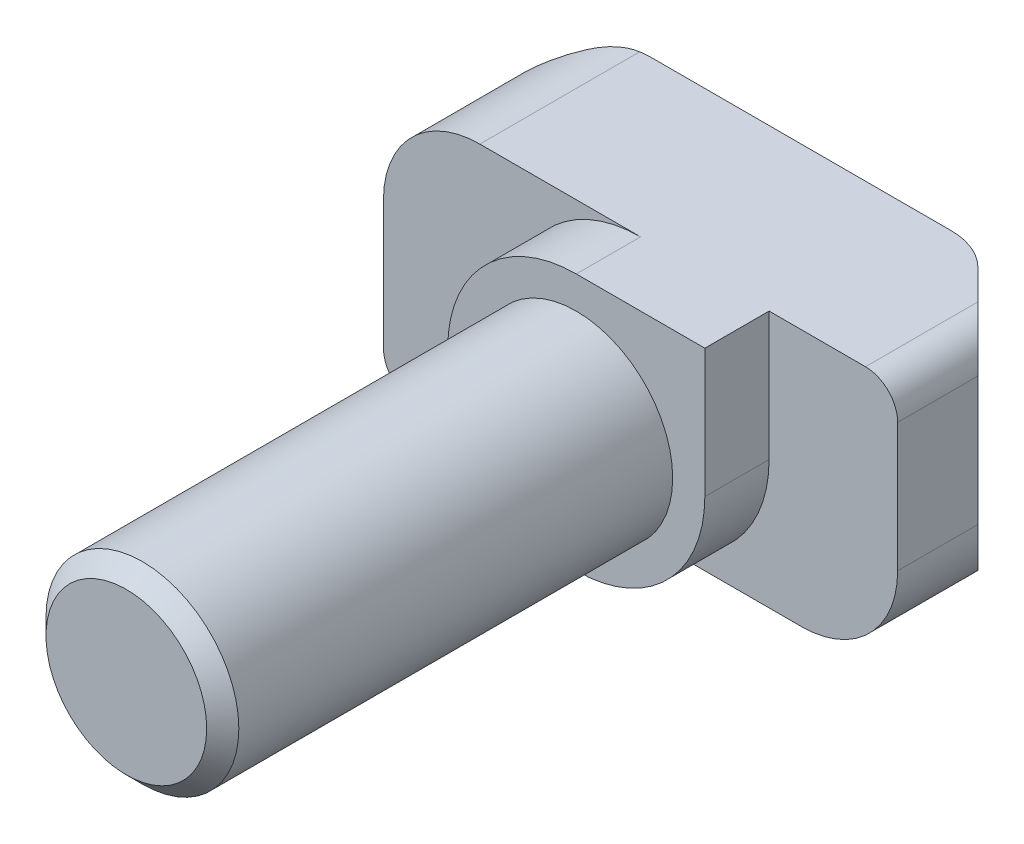
ISO-10303-21;
HEADER;
FILE_DESCRIPTION(('STEP AP214'),'2;1');
FILE_NAME('part.step','',(''),(''),'','','');
FILE_SCHEMA(('AUTOMOTIVE_DESIGN { 1 0 10303 214 1 1 1 1 }'));
ENDSEC;
DATA;
#1=APPLICATION_CONTEXT('core data for automotive mechanical design processes');
#2=APPLICATION_PROTOCOL_DEFINITION('international standard','automotive_design',2000,#1);
#3=PRODUCT_CONTEXT('',#1,'mechanical');
#4=PRODUCT('Part','Part','',(#3));
#5=PRODUCT_RELATED_PRODUCT_CATEGORY('part','',(#4));
#6=PRODUCT_DEFINITION_FORMATION('','',#4);
#7=PRODUCT_DEFINITION_CONTEXT('part definition',#1,'design');
#8=PRODUCT_DEFINITION('design','',#6,#7);
#9=PRODUCT_DEFINITION_SHAPE('','',#8);
#10=(LENGTH_UNIT() NAMED_UNIT(*) SI_UNIT(.MILLI.,.METRE.));
#11=(NAMED_UNIT(*) PLANE_ANGLE_UNIT() SI_UNIT($,.RADIAN.));
#12=(NAMED_UNIT(*) SI_UNIT($,.STERADIAN.) SOLID_ANGLE_UNIT());
#13=UNCERTAINTY_MEASURE_WITH_UNIT(LENGTH_MEASURE(1.E-05),#10,'distance_accuracy_value','');
#14=(GEOMETRIC_REPRESENTATION_CONTEXT(3) GLOBAL_UNCERTAINTY_ASSIGNED_CONTEXT((#13)) GLOBAL_UNIT_ASSIGNED_CONTEXT((#10,
#11,#12)) REPRESENTATION_CONTEXT('',''));
#15=CARTESIAN_POINT('',(0.,0.,0.));
#16=DIRECTION('',(0.,0.,1.));
#17=DIRECTION('',(1.,0.,0.));
#18=AXIS2_PLACEMENT_3D('',#15,#16,#17);
#19=CARTESIAN_POINT('',(-8.,-4.,2.5));
#20=DIRECTION('',(-1.,0.,0.));
#21=DIRECTION('',(0.,0.,1.));
#22=AXIS2_PLACEMENT_3D('',#19,#20,#21);
#23=PLANE('',#22);
#24=DIRECTION('',(0.,-1.,0.));
#25=VECTOR('',#24,1.);
#26=CARTESIAN_POINT('',(-8.,4.,5.));
#27=LINE('',#26,#25);
#28=CARTESIAN_POINT('',(-8.,1.,5.));
#29=VERTEX_POINT('',#28);
#30=CARTESIAN_POINT('',(-8.,-3.,5.));
#31=VERTEX_POINT('',#30);
#32=EDGE_CURVE('E203',#29,#31,#27,.T.);
#33=ORIENTED_EDGE('',*,*,#32,.F.);
#34=DIRECTION('',(0.,0.,1.));
#35=VECTOR('',#34,1.);
#36=CARTESIAN_POINT('',(-8.,1.,2.5));
#37=LINE('',#36,#35);
#38=CARTESIAN_POINT('',(-8.,1.,2.5));
#39=VERTEX_POINT('',#38);
#40=EDGE_CURVE('E354',#29,#39,#37,.F.);
#41=ORIENTED_EDGE('',*,*,#40,.T.);
#42=DIRECTION('',(0.,1.,0.));
#43=VECTOR('',#42,1.);
#44=CARTESIAN_POINT('',(-8.,-4.,2.5));
#45=LINE('',#44,#43);
#46=CARTESIAN_POINT('',(-8.,-3.,2.5));
#47=VERTEX_POINT('',#46);
#48=EDGE_CURVE('E230',#47,#39,#45,.T.);
#49=ORIENTED_EDGE('',*,*,#48,.F.);
#50=DIRECTION('',(0.,0.,1.));
#51=VECTOR('',#50,1.);
#52=CARTESIAN_POINT('',(-8.,-3.,5.));
#53=LINE('',#52,#51);
#54=EDGE_CURVE('E248',#47,#31,#53,.T.);
#55=ORIENTED_EDGE('',*,*,#54,.T.);
#56=EDGE_LOOP('',(#33,#41,#49,#55));
#57=FACE_BOUND('',#56,.T.);
#58=ADVANCED_FACE('F37',(#57),#23,.T.);
#59=CARTESIAN_POINT('',(-5.50000000000001,-4.,0.));
#60=DIRECTION('',(-0.707106781186548,0.,-0.707106781186547));
#61=DIRECTION('',(-0.707106781186547,0.,0.707106781186548));
#62=AXIS2_PLACEMENT_3D('',#59,#60,#61);
#63=PLANE('',#62);
#64=ORIENTED_EDGE('',*,*,#48,.T.);
#65=CARTESIAN_POINT('',(-5.,1.,-0.500000000000003));
#66=DIRECTION('',(-0.707106781186548,0.,-0.707106781186547));
#67=DIRECTION('',(-0.707106781186547,0.,0.707106781186548));
#68=AXIS2_PLACEMENT_3D('',#65,#66,#67);
#69=ELLIPSE('',#68,4.24264068711929,3.);
#70=CARTESIAN_POINT('',(-6.08578643762691,3.79661720867649,0.585786437626908));
#71=VERTEX_POINT('',#70);
#72=EDGE_CURVE('E316',#39,#71,#69,.T.);
#73=ORIENTED_EDGE('',*,*,#72,.T.);
#74=DIRECTION('',(0.,1.,0.));
#75=VECTOR('',#74,1.);
#76=CARTESIAN_POINT('',(-6.08578643762691,-4.,0.585786437626908));
#77=LINE('',#76,#75);
#78=CARTESIAN_POINT('',(-6.08578643762691,-4.,0.585786437626907));
#79=VERTEX_POINT('',#78);
#80=EDGE_CURVE('E275',#71,#79,#77,.F.);
#81=ORIENTED_EDGE('',*,*,#80,.T.);
#82=DIRECTION('',(-0.707106781186547,0.,0.707106781186548));
#83=VECTOR('',#82,1.);
#84=CARTESIAN_POINT('',(-5.50000000000001,-4.,0.));
#85=LINE('',#84,#83);
#86=CARTESIAN_POINT('',(-7.,-4.,1.5));
#87=VERTEX_POINT('',#86);
#88=EDGE_CURVE('E221',#79,#87,#85,.T.);
#89=ORIENTED_EDGE('',*,*,#88,.T.);
#90=CARTESIAN_POINT('',(-7.,-3.,1.5));
#91=DIRECTION('',(-0.707106781186548,0.,-0.707106781186547));
#92=DIRECTION('',(0.707106781186547,0.,-0.707106781186548));
#93=AXIS2_PLACEMENT_3D('',#90,#91,#92);
#94=ELLIPSE('',#93,1.4142135623731,1.);
#95=EDGE_CURVE('E256',#87,#47,#94,.T.);
#96=ORIENTED_EDGE('',*,*,#95,.T.);
#97=EDGE_LOOP('',(#64,#73,#81,#89,#96));
#98=FACE_BOUND('',#97,.T.);
#99=ADVANCED_FACE('F349',(#98),#63,.T.);
#100=CARTESIAN_POINT('',(5.5,-4.,0.));
#101=DIRECTION('',(0.,0.,-1.));
#102=DIRECTION('',(-1.,0.,0.));
#103=AXIS2_PLACEMENT_3D('',#100,#101,#102);
#104=PLANE('',#103);
#105=DIRECTION('',(-1.,0.,0.));
#106=VECTOR('',#105,1.);
#107=CARTESIAN_POINT('',(5.5,4.,0.));
#108=LINE('',#107,#106);
#109=CARTESIAN_POINT('',(4.67157287525381,4.,0.));
#110=VERTEX_POINT('',#109);
#111=CARTESIAN_POINT('',(-4.67157287525381,4.,0.));
#112=VERTEX_POINT('',#111);
#113=EDGE_CURVE('E218',#110,#112,#108,.T.);
#114=ORIENTED_EDGE('',*,*,#113,.F.);
#115=DIRECTION('',(0.,1.,0.));
#116=VECTOR('',#115,1.);
#117=CARTESIAN_POINT('',(4.67157287525381,-4.,0.));
#118=LINE('',#117,#116);
#119=CARTESIAN_POINT('',(4.67157287525381,-4.,0.));
#120=VERTEX_POINT('',#119);
#121=EDGE_CURVE('E268',#110,#120,#118,.F.);
#122=ORIENTED_EDGE('',*,*,#121,.T.);
#123=DIRECTION('',(-1.,0.,0.));
#124=VECTOR('',#123,1.);
#125=CARTESIAN_POINT('',(5.5,-4.,0.));
#126=LINE('',#125,#124);
#127=CARTESIAN_POINT('',(-4.67157287525381,-4.,0.));
#128=VERTEX_POINT('',#127);
#129=EDGE_CURVE('E217',#120,#128,#126,.T.);
#130=ORIENTED_EDGE('',*,*,#129,.T.);
#131=DIRECTION('',(0.,1.,0.));
#132=VECTOR('',#131,1.);
#133=CARTESIAN_POINT('',(-4.67157287525381,-4.,0.));
#134=LINE('',#133,#132);
#135=EDGE_CURVE('E265',#128,#112,#134,.T.);
#136=ORIENTED_EDGE('',*,*,#135,.T.);
#137=EDGE_LOOP('',(#114,#122,#130,#136));
#138=FACE_BOUND('',#137,.T.);
#139=ADVANCED_FACE('F380',(#138),#104,.T.);
#140=CARTESIAN_POINT('',(8.,-4.,2.5));
#141=DIRECTION('',(0.707106781186547,0.,-0.707106781186548));
#142=DIRECTION('',(-0.707106781186548,0.,-0.707106781186547));
#143=AXIS2_PLACEMENT_3D('',#140,#141,#142);
#144=PLANE('',#143);
#145=DIRECTION('',(0.,1.,0.));
#146=VECTOR('',#145,1.);
#147=CARTESIAN_POINT('',(8.,-4.,2.5));
#148=LINE('',#147,#146);
#149=CARTESIAN_POINT('',(8.,-1.,2.5));
#150=VERTEX_POINT('',#149);
#151=CARTESIAN_POINT('',(8.,3.,2.5));
#152=VERTEX_POINT('',#151);
#153=EDGE_CURVE('E223',#150,#152,#148,.T.);
#154=ORIENTED_EDGE('',*,*,#153,.F.);
#155=CARTESIAN_POINT('',(5.,-1.,-0.499999999999997));
#156=DIRECTION('',(0.707106781186547,0.,-0.707106781186548));
#157=DIRECTION('',(0.707106781186548,0.,0.707106781186547));
#158=AXIS2_PLACEMENT_3D('',#155,#156,#157);
#159=ELLIPSE('',#158,4.24264068711928,3.);
#160=CARTESIAN_POINT('',(6.0857864376269,-3.79661720867649,0.585786437626905));
#161=VERTEX_POINT('',#160);
#162=EDGE_CURVE('E280',#150,#161,#159,.T.);
#163=ORIENTED_EDGE('',*,*,#162,.T.);
#164=DIRECTION('',(0.,1.,0.));
#165=VECTOR('',#164,1.);
#166=CARTESIAN_POINT('',(6.0857864376269,-4.,0.585786437626905));
#167=LINE('',#166,#165);
#168=CARTESIAN_POINT('',(6.0857864376269,4.,0.585786437626904));
#169=VERTEX_POINT('',#168);
#170=EDGE_CURVE('E258',#161,#169,#167,.T.);
#171=ORIENTED_EDGE('',*,*,#170,.T.);
#172=DIRECTION('',(-0.707106781186548,0.,-0.707106781186547));
#173=VECTOR('',#172,1.);
#174=CARTESIAN_POINT('',(8.,4.,2.5));
#175=LINE('',#174,#173);
#176=CARTESIAN_POINT('',(7.,4.,1.5));
#177=VERTEX_POINT('',#176);
#178=EDGE_CURVE('E225',#177,#169,#175,.T.);
#179=ORIENTED_EDGE('',*,*,#178,.F.);
#180=CARTESIAN_POINT('',(7.,3.,1.5));
#181=DIRECTION('',(0.707106781186547,0.,-0.707106781186548));
#182=DIRECTION('',(-0.707106781186548,0.,-0.707106781186547));
#183=AXIS2_PLACEMENT_3D('',#180,#181,#182);
#184=ELLIPSE('',#183,1.41421356237309,1.);
#185=EDGE_CURVE('E242',#177,#152,#184,.T.);
#186=ORIENTED_EDGE('',*,*,#185,.T.);
#187=EDGE_LOOP('',(#154,#163,#171,#179,#186));
#188=FACE_BOUND('',#187,.T.);
#189=ADVANCED_FACE('F369',(#188),#144,.T.);
#190=CARTESIAN_POINT('',(8.,-4.,7.));
#191=DIRECTION('',(1.,0.,0.));
#192=DIRECTION('',(0.,0.,-1.));
#193=AXIS2_PLACEMENT_3D('',#190,#191,#192);
#194=PLANE('',#193);
#195=DIRECTION('',(0.,-1.,0.));
#196=VECTOR('',#195,1.);
#197=CARTESIAN_POINT('',(8.,4.,5.));
#198=LINE('',#197,#196);
#199=CARTESIAN_POINT('',(8.,3.,5.));
#200=VERTEX_POINT('',#199);
#201=CARTESIAN_POINT('',(8.,-1.,5.));
#202=VERTEX_POINT('',#201);
#203=EDGE_CURVE('E176',#200,#202,#198,.T.);
#204=ORIENTED_EDGE('',*,*,#203,.T.);
#205=DIRECTION('',(0.,0.,-1.));
#206=VECTOR('',#205,1.);
#207=CARTESIAN_POINT('',(8.,-1.,2.5));
#208=LINE('',#207,#206);
#209=EDGE_CURVE('E277',#202,#150,#208,.T.);
#210=ORIENTED_EDGE('',*,*,#209,.T.);
#211=ORIENTED_EDGE('',*,*,#153,.T.);
#212=DIRECTION('',(0.,0.,-1.));
#213=VECTOR('',#212,1.);
#214=CARTESIAN_POINT('',(8.,3.,7.));
#215=LINE('',#214,#213);
#216=EDGE_CURVE('E245',#152,#200,#215,.F.);
#217=ORIENTED_EDGE('',*,*,#216,.T.);
#218=EDGE_LOOP('',(#204,#210,#211,#217));
#219=FACE_BOUND('',#218,.T.);
#220=ADVANCED_FACE('F367',(#219),#194,.T.);
#221=CARTESIAN_POINT('',(-8.,-4.,7.));
#222=DIRECTION('',(0.,0.,1.));
#223=DIRECTION('',(1.,0.,0.));
#224=AXIS2_PLACEMENT_3D('',#221,#222,#223);
#225=PLANE('',#224);
#226=CARTESIAN_POINT('',(0.,0.,7.));
#227=DIRECTION('',(0.,0.,1.));
#228=DIRECTION('',(1.,0.,0.));
#229=AXIS2_PLACEMENT_3D('',#226,#227,#228);
#230=CIRCLE('',#229,3.);
#231=CARTESIAN_POINT('',(3.,0.,7.));
#232=VERTEX_POINT('',#231);
#233=EDGE_CURVE('E195',#232,#232,#230,.T.);
#234=ORIENTED_EDGE('',*,*,#233,.F.);
#235=EDGE_LOOP('',(#234));
#236=FACE_BOUND('',#235,.T.);
#237=DIRECTION('',(1.,0.,0.));
#238=VECTOR('',#237,1.);
#239=CARTESIAN_POINT('',(-8.,-4.,7.));
#240=LINE('',#239,#238);
#241=CARTESIAN_POINT('',(-4.,-4.,7.));
#242=VERTEX_POINT('',#241);
#243=CARTESIAN_POINT('',(0.,-4.,7.));
#244=VERTEX_POINT('',#243);
#245=EDGE_CURVE('E214',#242,#244,#240,.T.);
#246=ORIENTED_EDGE('',*,*,#245,.T.);
#247=CARTESIAN_POINT('',(0.,0.,7.));
#248=DIRECTION('',(0.,0.,1.));
#249=DIRECTION('',(1.,0.,0.));
#250=AXIS2_PLACEMENT_3D('',#247,#248,#249);
#251=CIRCLE('',#250,4.);
#252=CARTESIAN_POINT('',(4.,0.,7.));
#253=VERTEX_POINT('',#252);
#254=EDGE_CURVE('E323',#244,#253,#251,.T.);
#255=ORIENTED_EDGE('',*,*,#254,.T.);
#256=DIRECTION('',(0.,-1.,0.));
#257=VECTOR('',#256,1.);
#258=CARTESIAN_POINT('',(4.,4.,7.));
#259=LINE('',#258,#257);
#260=CARTESIAN_POINT('',(4.,4.,7.));
#261=VERTEX_POINT('',#260);
#262=EDGE_CURVE('E197',#261,#253,#259,.T.);
#263=ORIENTED_EDGE('',*,*,#262,.F.);
#264=DIRECTION('',(1.,0.,0.));
#265=VECTOR('',#264,1.);
#266=CARTESIAN_POINT('',(-8.,4.,7.));
#267=LINE('',#266,#265);
#268=CARTESIAN_POINT('',(0.,4.,7.));
#269=VERTEX_POINT('',#268);
#270=EDGE_CURVE('E190',#269,#261,#267,.T.);
#271=ORIENTED_EDGE('',*,*,#270,.F.);
#272=CARTESIAN_POINT('',(0.,0.,7.));
#273=DIRECTION('',(0.,0.,1.));
#274=DIRECTION('',(1.,0.,0.));
#275=AXIS2_PLACEMENT_3D('',#272,#273,#274);
#276=CIRCLE('',#275,4.);
#277=CARTESIAN_POINT('',(-4.,0.,7.));
#278=VERTEX_POINT('',#277);
#279=EDGE_CURVE('E321',#269,#278,#276,.T.);
#280=ORIENTED_EDGE('',*,*,#279,.T.);
#281=DIRECTION('',(0.,-1.,0.));
#282=VECTOR('',#281,1.);
#283=CARTESIAN_POINT('',(-4.,4.,7.));
#284=LINE('',#283,#282);
#285=EDGE_CURVE('E209',#278,#242,#284,.T.);
#286=ORIENTED_EDGE('',*,*,#285,.T.);
#287=EDGE_LOOP('',(#246,#255,#263,#271,#280,#286));
#288=FACE_BOUND('',#287,.T.);
#289=ADVANCED_FACE('F336',(#236,#288),#225,.T.);
#290=CARTESIAN_POINT('',(0.,-4.,0.));
#291=DIRECTION('',(0.,1.,0.));
#292=DIRECTION('',(0.,0.,1.));
#293=AXIS2_PLACEMENT_3D('',#290,#291,#292);
#294=PLANE('',#293);
#295=DIRECTION('',(1.,0.,0.));
#296=VECTOR('',#295,1.);
#297=CARTESIAN_POINT('',(4.,-4.,5.));
#298=LINE('',#297,#296);
#299=CARTESIAN_POINT('',(0.,-4.,5.));
#300=VERTEX_POINT('',#299);
#301=CARTESIAN_POINT('',(5.,-4.,5.));
#302=VERTEX_POINT('',#301);
#303=EDGE_CURVE('E191',#300,#302,#298,.T.);
#304=ORIENTED_EDGE('',*,*,#303,.F.);
#305=DIRECTION('',(0.,0.,-1.));
#306=VECTOR('',#305,1.);
#307=CARTESIAN_POINT('',(0.,-4.,0.));
#308=LINE('',#307,#306);
#309=EDGE_CURVE('E319',#300,#244,#308,.F.);
#310=ORIENTED_EDGE('',*,*,#309,.T.);
#311=ORIENTED_EDGE('',*,*,#245,.F.);
#312=DIRECTION('',(0.,0.,1.));
#313=VECTOR('',#312,1.);
#314=CARTESIAN_POINT('',(-4.,-4.,5.));
#315=LINE('',#314,#313);
#316=CARTESIAN_POINT('',(-4.,-4.,5.));
#317=VERTEX_POINT('',#316);
#318=EDGE_CURVE('E204',#317,#242,#315,.T.);
#319=ORIENTED_EDGE('',*,*,#318,.F.);
#320=DIRECTION('',(1.,0.,0.));
#321=VECTOR('',#320,1.);
#322=CARTESIAN_POINT('',(-8.,-4.,5.));
#323=LINE('',#322,#321);
#324=CARTESIAN_POINT('',(-7.,-4.,5.));
#325=VERTEX_POINT('',#324);
#326=EDGE_CURVE('E199',#325,#317,#323,.T.);
#327=ORIENTED_EDGE('',*,*,#326,.F.);
#328=DIRECTION('',(0.,0.,1.));
#329=VECTOR('',#328,1.);
#330=CARTESIAN_POINT('',(-7.,-4.,2.5));
#331=LINE('',#330,#329);
#332=EDGE_CURVE('E253',#325,#87,#331,.F.);
#333=ORIENTED_EDGE('',*,*,#332,.T.);
#334=ORIENTED_EDGE('',*,*,#88,.F.);
#335=CARTESIAN_POINT('',(-4.67157287525381,-4.,2.));
#336=DIRECTION('',(0.,1.,0.));
#337=DIRECTION('',(0.,0.,1.));
#338=AXIS2_PLACEMENT_3D('',#335,#336,#337);
#339=CIRCLE('',#338,2.);
#340=EDGE_CURVE('E270',#79,#128,#339,.F.);
#341=ORIENTED_EDGE('',*,*,#340,.T.);
#342=ORIENTED_EDGE('',*,*,#129,.F.);
#343=CARTESIAN_POINT('',(4.67157287525381,-4.,2.));
#344=DIRECTION('',(0.,1.,0.));
#345=DIRECTION('',(0.,0.,1.));
#346=AXIS2_PLACEMENT_3D('',#343,#344,#345);
#347=CIRCLE('',#346,2.);
#348=CARTESIAN_POINT('',(5.,-4.,0.0271503798487459));
#349=VERTEX_POINT('',#348);
#350=EDGE_CURVE('E272',#120,#349,#347,.F.);
#351=ORIENTED_EDGE('',*,*,#350,.T.);
#352=DIRECTION('',(0.,0.,-1.));
#353=VECTOR('',#352,1.);
#354=CARTESIAN_POINT('',(5.,-4.,5.));
#355=LINE('',#354,#353);
#356=EDGE_CURVE('E290',#349,#302,#355,.F.);
#357=ORIENTED_EDGE('',*,*,#356,.T.);
#358=EDGE_LOOP('',(#304,#310,#311,#319,#327,#333,#334,#341,#342,#351,#357));
#359=FACE_BOUND('',#358,.T.);
#360=ADVANCED_FACE('F333',(#359),#294,.F.);
#361=CARTESIAN_POINT('',(0.,4.,0.));
#362=DIRECTION('',(0.,1.,0.));
#363=DIRECTION('',(0.,0.,1.));
#364=AXIS2_PLACEMENT_3D('',#361,#362,#363);
#365=PLANE('',#364);
#366=DIRECTION('',(1.,0.,0.));
#367=VECTOR('',#366,1.);
#368=CARTESIAN_POINT('',(-8.,4.,5.));
#369=LINE('',#368,#367);
#370=CARTESIAN_POINT('',(-5.,4.,5.));
#371=VERTEX_POINT('',#370);
#372=CARTESIAN_POINT('',(0.,4.,5.));
#373=VERTEX_POINT('',#372);
#374=EDGE_CURVE('E60',#371,#373,#369,.T.);
#375=ORIENTED_EDGE('',*,*,#374,.T.);
#376=DIRECTION('',(0.,0.,1.));
#377=VECTOR('',#376,1.);
#378=CARTESIAN_POINT('',(0.,4.,7.));
#379=LINE('',#378,#377);
#380=EDGE_CURVE('E325',#373,#269,#379,.T.);
#381=ORIENTED_EDGE('',*,*,#380,.T.);
#382=ORIENTED_EDGE('',*,*,#270,.T.);
#383=DIRECTION('',(0.,0.,-1.));
#384=VECTOR('',#383,1.);
#385=CARTESIAN_POINT('',(4.,4.,7.));
#386=LINE('',#385,#384);
#387=CARTESIAN_POINT('',(4.,4.,5.));
#388=VERTEX_POINT('',#387);
#389=EDGE_CURVE('E170',#261,#388,#386,.T.);
#390=ORIENTED_EDGE('',*,*,#389,.T.);
#391=DIRECTION('',(1.,0.,0.));
#392=VECTOR('',#391,1.);
#393=CARTESIAN_POINT('',(4.,4.,5.));
#394=LINE('',#393,#392);
#395=CARTESIAN_POINT('',(7.,4.,5.));
#396=VERTEX_POINT('',#395);
#397=EDGE_CURVE('E177',#388,#396,#394,.T.);
#398=ORIENTED_EDGE('',*,*,#397,.T.);
#399=DIRECTION('',(0.,0.,-1.));
#400=VECTOR('',#399,1.);
#401=CARTESIAN_POINT('',(7.,4.,0.));
#402=LINE('',#401,#400);
#403=EDGE_CURVE('E240',#396,#177,#402,.T.);
#404=ORIENTED_EDGE('',*,*,#403,.T.);
#405=ORIENTED_EDGE('',*,*,#178,.T.);
#406=CARTESIAN_POINT('',(4.67157287525381,4.,2.));
#407=DIRECTION('',(0.,1.,0.));
#408=DIRECTION('',(0.,0.,1.));
#409=AXIS2_PLACEMENT_3D('',#406,#407,#408);
#410=CIRCLE('',#409,2.);
#411=EDGE_CURVE('E263',#169,#110,#410,.T.);
#412=ORIENTED_EDGE('',*,*,#411,.T.);
#413=ORIENTED_EDGE('',*,*,#113,.T.);
#414=CARTESIAN_POINT('',(-4.67157287525381,4.,2.));
#415=DIRECTION('',(0.,1.,0.));
#416=DIRECTION('',(0.,0.,1.));
#417=AXIS2_PLACEMENT_3D('',#414,#415,#416);
#418=CIRCLE('',#417,2.);
#419=CARTESIAN_POINT('',(-5.,4.,0.0271503798487459));
#420=VERTEX_POINT('',#419);
#421=EDGE_CURVE('E260',#112,#420,#418,.T.);
#422=ORIENTED_EDGE('',*,*,#421,.T.);
#423=DIRECTION('',(0.,0.,1.));
#424=VECTOR('',#423,1.);
#425=CARTESIAN_POINT('',(-5.,4.,0.));
#426=LINE('',#425,#424);
#427=EDGE_CURVE('E356',#420,#371,#426,.T.);
#428=ORIENTED_EDGE('',*,*,#427,.T.);
#429=EDGE_LOOP('',(#375,#381,#382,#390,#398,#404,#405,#412,#413,#422,#428));
#430=FACE_BOUND('',#429,.T.);
#431=ADVANCED_FACE('F188',(#430),#365,.T.);
#432=CARTESIAN_POINT('',(-4.,4.,5.));
#433=DIRECTION('',(1.,0.,0.));
#434=DIRECTION('',(0.,0.,-1.));
#435=AXIS2_PLACEMENT_3D('',#432,#433,#434);
#436=PLANE('',#435);
#437=ORIENTED_EDGE('',*,*,#285,.F.);
#438=DIRECTION('',(0.,0.,1.));
#439=VECTOR('',#438,1.);
#440=CARTESIAN_POINT('',(-4.,0.,5.));
#441=LINE('',#440,#439);
#442=CARTESIAN_POINT('',(-4.,0.,5.));
#443=VERTEX_POINT('',#442);
#444=EDGE_CURVE('E52',#278,#443,#441,.F.);
#445=ORIENTED_EDGE('',*,*,#444,.T.);
#446=DIRECTION('',(0.,-1.,0.));
#447=VECTOR('',#446,1.);
#448=CARTESIAN_POINT('',(-4.,4.,5.));
#449=LINE('',#448,#447);
#450=EDGE_CURVE('E211',#443,#317,#449,.T.);
#451=ORIENTED_EDGE('',*,*,#450,.T.);
#452=ORIENTED_EDGE('',*,*,#318,.T.);
#453=EDGE_LOOP('',(#437,#445,#451,#452));
#454=FACE_BOUND('',#453,.T.);
#455=ADVANCED_FACE('F337',(#454),#436,.F.);
#456=CARTESIAN_POINT('',(-8.,4.,5.));
#457=DIRECTION('',(0.,0.,-1.));
#458=DIRECTION('',(-1.,0.,0.));
#459=AXIS2_PLACEMENT_3D('',#456,#457,#458);
#460=PLANE('',#459);
#461=ORIENTED_EDGE('',*,*,#374,.F.);
#462=CARTESIAN_POINT('',(-5.,1.,5.));
#463=DIRECTION('',(0.,0.,-1.));
#464=DIRECTION('',(-1.,0.,0.));
#465=AXIS2_PLACEMENT_3D('',#462,#463,#464);
#466=CIRCLE('',#465,3.);
#467=EDGE_CURVE('E355',#371,#29,#466,.F.);
#468=ORIENTED_EDGE('',*,*,#467,.T.);
#469=ORIENTED_EDGE('',*,*,#32,.T.);
#470=CARTESIAN_POINT('',(-7.,-3.,5.));
#471=DIRECTION('',(0.,0.,-1.));
#472=DIRECTION('',(-1.,0.,0.));
#473=AXIS2_PLACEMENT_3D('',#470,#471,#472);
#474=CIRCLE('',#473,1.);
#475=EDGE_CURVE('E251',#31,#325,#474,.F.);
#476=ORIENTED_EDGE('',*,*,#475,.T.);
#477=ORIENTED_EDGE('',*,*,#326,.T.);
#478=ORIENTED_EDGE('',*,*,#450,.F.);
#479=CARTESIAN_POINT('',(0.,0.,5.));
#480=DIRECTION('',(0.,0.,-1.));
#481=DIRECTION('',(-1.,0.,0.));
#482=AXIS2_PLACEMENT_3D('',#479,#480,#481);
#483=CIRCLE('',#482,4.);
#484=EDGE_CURVE('E11',#443,#373,#483,.T.);
#485=ORIENTED_EDGE('',*,*,#484,.T.);
#486=EDGE_LOOP('',(#461,#468,#469,#476,#477,#478,#485));
#487=FACE_BOUND('',#486,.T.);
#488=ADVANCED_FACE('F505',(#487),#460,.F.);
#489=CARTESIAN_POINT('',(4.,4.,7.));
#490=DIRECTION('',(-1.,0.,0.));
#491=DIRECTION('',(0.,0.,1.));
#492=AXIS2_PLACEMENT_3D('',#489,#490,#491);
#493=PLANE('',#492);
#494=ORIENTED_EDGE('',*,*,#262,.T.);
#495=DIRECTION('',(0.,0.,-1.));
#496=VECTOR('',#495,1.);
#497=CARTESIAN_POINT('',(4.,0.,7.));
#498=LINE('',#497,#496);
#499=CARTESIAN_POINT('',(4.,0.,5.));
#500=VERTEX_POINT('',#499);
#501=EDGE_CURVE('E173',#253,#500,#498,.T.);
#502=ORIENTED_EDGE('',*,*,#501,.T.);
#503=DIRECTION('',(0.,-1.,0.));
#504=VECTOR('',#503,1.);
#505=CARTESIAN_POINT('',(4.,4.,5.));
#506=LINE('',#505,#504);
#507=EDGE_CURVE('E165',#388,#500,#506,.T.);
#508=ORIENTED_EDGE('',*,*,#507,.F.);
#509=ORIENTED_EDGE('',*,*,#389,.F.);
#510=EDGE_LOOP('',(#494,#502,#508,#509));
#511=FACE_BOUND('',#510,.T.);
#512=ADVANCED_FACE('F168',(#511),#493,.F.);
#513=CARTESIAN_POINT('',(4.,4.,5.));
#514=DIRECTION('',(0.,0.,-1.));
#515=DIRECTION('',(-1.,0.,0.));
#516=AXIS2_PLACEMENT_3D('',#513,#514,#515);
#517=PLANE('',#516);
#518=ORIENTED_EDGE('',*,*,#303,.T.);
#519=CARTESIAN_POINT('',(5.,-1.,5.));
#520=DIRECTION('',(0.,0.,-1.));
#521=DIRECTION('',(-1.,0.,0.));
#522=AXIS2_PLACEMENT_3D('',#519,#520,#521);
#523=CIRCLE('',#522,3.);
#524=EDGE_CURVE('E359',#302,#202,#523,.F.);
#525=ORIENTED_EDGE('',*,*,#524,.T.);
#526=ORIENTED_EDGE('',*,*,#203,.F.);
#527=CARTESIAN_POINT('',(7.,3.,5.));
#528=DIRECTION('',(0.,0.,-1.));
#529=DIRECTION('',(-1.,0.,0.));
#530=AXIS2_PLACEMENT_3D('',#527,#528,#529);
#531=CIRCLE('',#530,1.);
#532=EDGE_CURVE('E184',#200,#396,#531,.F.);
#533=ORIENTED_EDGE('',*,*,#532,.T.);
#534=ORIENTED_EDGE('',*,*,#397,.F.);
#535=ORIENTED_EDGE('',*,*,#507,.T.);
#536=CARTESIAN_POINT('',(0.,0.,5.));
#537=DIRECTION('',(0.,0.,-1.));
#538=DIRECTION('',(-1.,0.,0.));
#539=AXIS2_PLACEMENT_3D('',#536,#537,#538);
#540=CIRCLE('',#539,4.);
#541=EDGE_CURVE('E45',#500,#300,#540,.T.);
#542=ORIENTED_EDGE('',*,*,#541,.T.);
#543=EDGE_LOOP('',(#518,#525,#526,#533,#534,#535,#542));
#544=FACE_BOUND('',#543,.T.);
#545=ADVANCED_FACE('F181',(#544),#517,.F.);
#546=CARTESIAN_POINT('',(0.,0.,7.));
#547=DIRECTION('',(0.,0.,1.));
#548=DIRECTION('',(1.,0.,0.));
#549=AXIS2_PLACEMENT_3D('',#546,#547,#548);
#550=CYLINDRICAL_SURFACE('',#549,3.);
#551=CARTESIAN_POINT('',(0.,0.,20.4999960046574));
#552=DIRECTION('',(0.,0.,1.));
#553=DIRECTION('',(1.,0.,0.));
#554=AXIS2_PLACEMENT_3D('',#551,#552,#553);
#555=CIRCLE('',#554,3.);
#556=CARTESIAN_POINT('',(3.,0.,20.4999960046574));
#557=VERTEX_POINT('',#556);
#558=EDGE_CURVE('E237',#557,#557,#555,.F.);
#559=ORIENTED_EDGE('',*,*,#558,.T.);
#560=EDGE_LOOP('',(#559));
#561=FACE_BOUND('',#560,.T.);
#562=ORIENTED_EDGE('',*,*,#233,.T.);
#563=EDGE_LOOP('',(#562));
#564=FACE_BOUND('',#563,.T.);
#565=ADVANCED_FACE('F530',(#561,#564),#550,.T.);
#566=CARTESIAN_POINT('',(0.,0.,21.));
#567=DIRECTION('',(0.,0.,1.));
#568=DIRECTION('',(1.,0.,0.));
#569=AXIS2_PLACEMENT_3D('',#566,#567,#568);
#570=PLANE('',#569);
#571=CARTESIAN_POINT('',(0.,0.,21.));
#572=DIRECTION('',(0.,0.,1.));
#573=DIRECTION('',(1.,0.,0.));
#574=AXIS2_PLACEMENT_3D('',#571,#572,#573);
#575=CIRCLE('',#574,2.49999709508467);
#576=CARTESIAN_POINT('',(2.49999709508467,0.,21.));
#577=VERTEX_POINT('',#576);
#578=EDGE_CURVE('E234',#577,#577,#575,.T.);
#579=ORIENTED_EDGE('',*,*,#578,.T.);
#580=EDGE_LOOP('',(#579));
#581=FACE_BOUND('',#580,.T.);
#582=ADVANCED_FACE('F403',(#581),#570,.T.);
#583=CARTESIAN_POINT('',(0.,0.,21.));
#584=DIRECTION('',(0.,0.,-1.));
#585=DIRECTION('',(-1.,0.,0.));
#586=AXIS2_PLACEMENT_3D('',#583,#584,#585);
#587=CONICAL_SURFACE('',#586,2.49999709508467,0.785397072977674);
#588=ORIENTED_EDGE('',*,*,#558,.F.);
#589=EDGE_LOOP('',(#588));
#590=FACE_BOUND('',#589,.T.);
#591=ORIENTED_EDGE('',*,*,#578,.F.);
#592=EDGE_LOOP('',(#591));
#593=FACE_BOUND('',#592,.T.);
#594=ADVANCED_FACE('F398',(#590,#593),#587,.T.);
#595=CARTESIAN_POINT('',(7.,3.,0.));
#596=DIRECTION('',(0.,0.,-1.));
#597=DIRECTION('',(-1.,0.,0.));
#598=AXIS2_PLACEMENT_3D('',#595,#596,#597);
#599=CYLINDRICAL_SURFACE('',#598,1.);
#600=ORIENTED_EDGE('',*,*,#532,.F.);
#601=ORIENTED_EDGE('',*,*,#216,.F.);
#602=ORIENTED_EDGE('',*,*,#185,.F.);
#603=ORIENTED_EDGE('',*,*,#403,.F.);
#604=EDGE_LOOP('',(#600,#601,#602,#603));
#605=FACE_BOUND('',#604,.T.);
#606=ADVANCED_FACE('F374',(#605),#599,.T.);
#607=CARTESIAN_POINT('',(-7.,-3.,2.5));
#608=DIRECTION('',(0.,0.,-1.));
#609=DIRECTION('',(-1.,0.,0.));
#610=AXIS2_PLACEMENT_3D('',#607,#608,#609);
#611=CYLINDRICAL_SURFACE('',#610,1.);
#612=ORIENTED_EDGE('',*,*,#95,.F.);
#613=ORIENTED_EDGE('',*,*,#332,.F.);
#614=ORIENTED_EDGE('',*,*,#475,.F.);
#615=ORIENTED_EDGE('',*,*,#54,.F.);
#616=EDGE_LOOP('',(#612,#613,#614,#615));
#617=FACE_BOUND('',#616,.T.);
#618=ADVANCED_FACE('F345',(#617),#611,.T.);
#619=CARTESIAN_POINT('',(4.67157287525381,-4.,2.));
#620=DIRECTION('',(0.,1.,0.));
#621=DIRECTION('',(0.,0.,1.));
#622=AXIS2_PLACEMENT_3D('',#619,#620,#621);
#623=CYLINDRICAL_SURFACE('',#622,2.);
#624=ORIENTED_EDGE('',*,*,#170,.F.);
#625=CARTESIAN_POINT('',(6.0857864376269,-3.79661720867649,0.585786437626905));
#626=CARTESIAN_POINT('',(6.04835150685286,-3.81114934512866,0.548362623812733));
#627=CARTESIAN_POINT('',(6.00940693884797,-3.82540497787574,0.51238203401474));
#628=CARTESIAN_POINT('',(5.92856629680353,-3.85299794440073,0.443464497667013));
#629=CARTESIAN_POINT('',(5.88666841905598,-3.86633470698169,0.41052944003534));
#630=CARTESIAN_POINT('',(5.75925459459005,-3.90364871527323,0.318428419512852));
#631=CARTESIAN_POINT('',(5.66980993129956,-3.92582259461321,0.263758889572601));
#632=CARTESIAN_POINT('',(5.53190728817466,-3.95281541653805,0.193817777100017));
#633=CARTESIAN_POINT('',(5.48674538457817,-3.96061589512063,0.172985515741081));
#634=CARTESIAN_POINT('',(5.39473183401763,-3.97428072691575,0.134652598525427));
#635=CARTESIAN_POINT('',(5.34788037628463,-3.98014529620882,0.11715157093852));
#636=CARTESIAN_POINT('',(5.25150247934223,-3.98984144469628,0.0852346928986245));
#637=CARTESIAN_POINT('',(5.20193794741303,-3.99361346489451,0.0709155747572581));
#638=CARTESIAN_POINT('',(5.10169783004914,-3.99869872157745,0.0461140513930794));
#639=CARTESIAN_POINT('',(5.05102146049905,-4.00001016242272,0.0356344525932637));
#640=CARTESIAN_POINT('',(5.,-4.,0.0271503798487456));
#641=B_SPLINE_CURVE_WITH_KNOTS('',3,(#625,#626,#627,#628,#629,#630,#631,#632,#633,#634,#635,
#636,#637,#638,#639,#640),.UNSPECIFIED.,.F.,.F.,(4,2,2,2,2,2,2,4),(0.,0.16457375705353,
0.329248911834442,0.648958648831475,0.799853847084041,0.950732197156448,1.10570948713893,
1.26079982986918),.UNSPECIFIED.);
#642=EDGE_CURVE('E282',#161,#349,#641,.T.);
#643=ORIENTED_EDGE('',*,*,#642,.T.);
#644=ORIENTED_EDGE('',*,*,#350,.F.);
#645=ORIENTED_EDGE('',*,*,#121,.F.);
#646=ORIENTED_EDGE('',*,*,#411,.F.);
#647=EDGE_LOOP('',(#624,#643,#644,#645,#646));
#648=FACE_BOUND('',#647,.T.);
#649=ADVANCED_FACE('F292',(#648),#623,.T.);
#650=CARTESIAN_POINT('',(-4.67157287525381,-4.,2.));
#651=DIRECTION('',(0.,1.,0.));
#652=DIRECTION('',(0.,0.,1.));
#653=AXIS2_PLACEMENT_3D('',#650,#651,#652);
#654=CYLINDRICAL_SURFACE('',#653,2.);
#655=ORIENTED_EDGE('',*,*,#80,.F.);
#656=CARTESIAN_POINT('',(-6.08578643762691,3.79661720867649,0.585786437626908));
#657=CARTESIAN_POINT('',(-6.04835150685287,3.81114934512866,0.548362623812735));
#658=CARTESIAN_POINT('',(-6.00940693884798,3.82540497787573,0.512382034014741));
#659=CARTESIAN_POINT('',(-5.92856629680354,3.85299794440072,0.443464497667015));
#660=CARTESIAN_POINT('',(-5.88666841905599,3.86633470698169,0.410529440035341));
#661=CARTESIAN_POINT('',(-5.75925459459006,3.90364871527323,0.318428419512854));
#662=CARTESIAN_POINT('',(-5.66980993129957,3.9258225946132,0.263758889572603));
#663=CARTESIAN_POINT('',(-5.53190728817466,3.95281541653805,0.193817777100018));
#664=CARTESIAN_POINT('',(-5.48674538457818,3.96061589512063,0.172985515741082));
#665=CARTESIAN_POINT('',(-5.39473183401763,3.97428072691574,0.134652598525427));
#666=CARTESIAN_POINT('',(-5.34788037628464,3.98014529620882,0.11715157093852));
#667=CARTESIAN_POINT('',(-5.25150247934224,3.98984144469628,0.0852346928986248));
#668=CARTESIAN_POINT('',(-5.20193794741303,3.99361346489451,0.0709155747572585));
#669=CARTESIAN_POINT('',(-5.10169783004914,3.99869872157745,0.0461140513930799));
#670=CARTESIAN_POINT('',(-5.05102146049905,4.00001016242272,0.0356344525932642));
#671=CARTESIAN_POINT('',(-5.,4.,0.027150379848746));
#672=B_SPLINE_CURVE_WITH_KNOTS('',3,(#656,#657,#658,#659,#660,#661,#662,#663,#664,#665,#666,
#667,#668,#669,#670,#671),.UNSPECIFIED.,.F.,.F.,(4,2,2,2,2,2,2,4),(0.,0.164573757053531,
0.329248911834444,0.648958648831476,0.799853847084045,0.950732197156454,1.10570948713894,
1.26079982986919),.UNSPECIFIED.);
#673=EDGE_CURVE('E309',#71,#420,#672,.T.);
#674=ORIENTED_EDGE('',*,*,#673,.T.);
#675=ORIENTED_EDGE('',*,*,#421,.F.);
#676=ORIENTED_EDGE('',*,*,#135,.F.);
#677=ORIENTED_EDGE('',*,*,#340,.F.);
#678=EDGE_LOOP('',(#655,#674,#675,#676,#677));
#679=FACE_BOUND('',#678,.T.);
#680=ADVANCED_FACE('F301',(#679),#654,.T.);
#681=CARTESIAN_POINT('',(5.,-1.,7.));
#682=DIRECTION('',(0.,0.,1.));
#683=DIRECTION('',(1.,0.,0.));
#684=AXIS2_PLACEMENT_3D('',#681,#682,#683);
#685=CYLINDRICAL_SURFACE('',#684,3.);
#686=ORIENTED_EDGE('',*,*,#524,.F.);
#687=ORIENTED_EDGE('',*,*,#356,.F.);
#688=ORIENTED_EDGE('',*,*,#642,.F.);
#689=ORIENTED_EDGE('',*,*,#162,.F.);
#690=ORIENTED_EDGE('',*,*,#209,.F.);
#691=EDGE_LOOP('',(#686,#687,#688,#689,#690));
#692=FACE_BOUND('',#691,.T.);
#693=ADVANCED_FACE('F296',(#692),#685,.T.);
#694=CARTESIAN_POINT('',(-5.,1.,0.));
#695=DIRECTION('',(0.,0.,1.));
#696=DIRECTION('',(1.,0.,0.));
#697=AXIS2_PLACEMENT_3D('',#694,#695,#696);
#698=CYLINDRICAL_SURFACE('',#697,3.);
#699=ORIENTED_EDGE('',*,*,#72,.F.);
#700=ORIENTED_EDGE('',*,*,#40,.F.);
#701=ORIENTED_EDGE('',*,*,#467,.F.);
#702=ORIENTED_EDGE('',*,*,#427,.F.);
#703=ORIENTED_EDGE('',*,*,#673,.F.);
#704=EDGE_LOOP('',(#699,#700,#701,#702,#703));
#705=FACE_BOUND('',#704,.T.);
#706=ADVANCED_FACE('F300',(#705),#698,.T.);
#707=CARTESIAN_POINT('',(0.,0.,7.));
#708=DIRECTION('',(0.,0.,-1.));
#709=DIRECTION('',(-1.,0.,0.));
#710=AXIS2_PLACEMENT_3D('',#707,#708,#709);
#711=CYLINDRICAL_SURFACE('',#710,4.);
#712=ORIENTED_EDGE('',*,*,#254,.F.);
#713=ORIENTED_EDGE('',*,*,#309,.F.);
#714=ORIENTED_EDGE('',*,*,#541,.F.);
#715=ORIENTED_EDGE('',*,*,#501,.F.);
#716=EDGE_LOOP('',(#712,#713,#714,#715));
#717=FACE_BOUND('',#716,.T.);
#718=ADVANCED_FACE('F306',(#717),#711,.T.);
#719=CARTESIAN_POINT('',(0.,0.,0.));
#720=DIRECTION('',(0.,0.,-1.));
#721=DIRECTION('',(-1.,0.,0.));
#722=AXIS2_PLACEMENT_3D('',#719,#720,#721);
#723=CYLINDRICAL_SURFACE('',#722,4.);
#724=ORIENTED_EDGE('',*,*,#484,.F.);
#725=ORIENTED_EDGE('',*,*,#444,.F.);
#726=ORIENTED_EDGE('',*,*,#279,.F.);
#727=ORIENTED_EDGE('',*,*,#380,.F.);
#728=EDGE_LOOP('',(#724,#725,#726,#727));
#729=FACE_BOUND('',#728,.T.);
#730=ADVANCED_FACE('F39',(#729),#723,.T.);
#731=CLOSED_SHELL('',(#58,#99,#139,#189,#220,#289,#360,#431,#455,#488,#512,#545,#565,#582,#594,
#606,#618,#649,#680,#693,#706,#718,#730));
#732=MANIFOLD_SOLID_BREP('B2',#731);
#733=ADVANCED_BREP_SHAPE_REPRESENTATION('',(#18,#732),#14);
#734=SHAPE_DEFINITION_REPRESENTATION(#9,#733);
ENDSEC;
END-ISO-10303-21;
